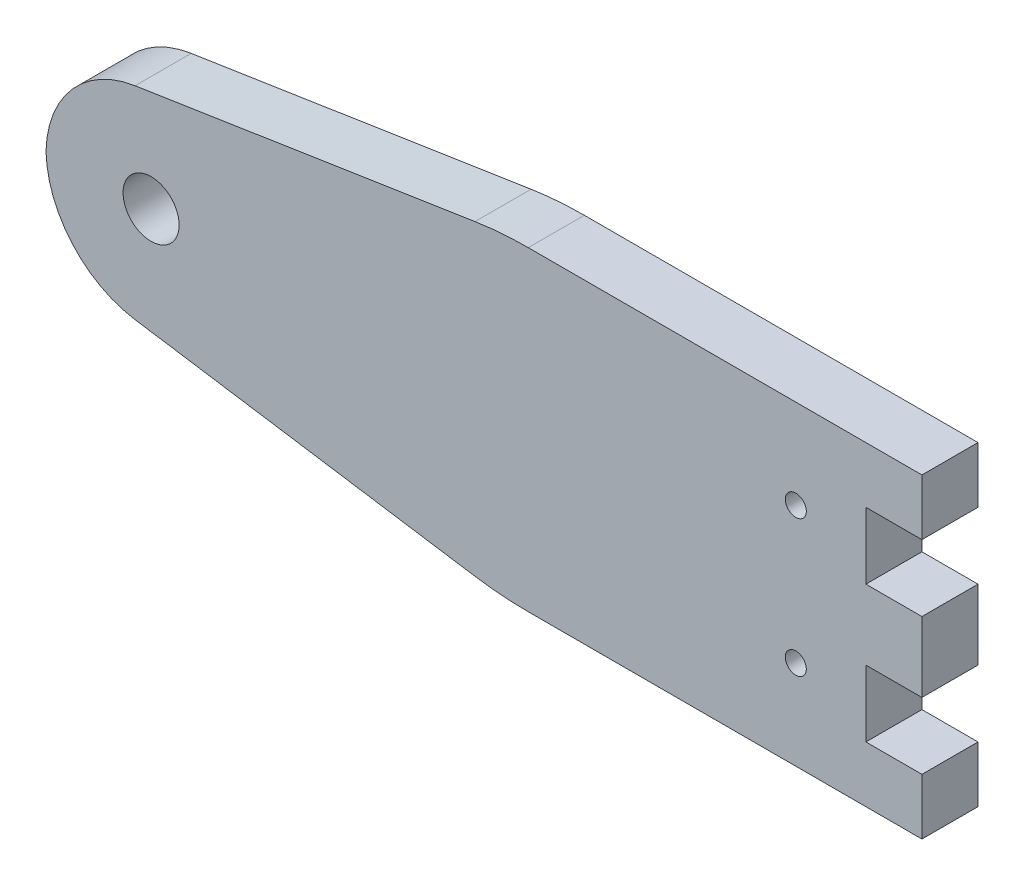
ISO-10303-21;
HEADER;
FILE_DESCRIPTION(('STEP AP214'),'2;1');
FILE_NAME('part.step','',(''),(''),'','','');
FILE_SCHEMA(('AUTOMOTIVE_DESIGN { 1 0 10303 214 1 1 1 1 }'));
ENDSEC;
DATA;
#1=APPLICATION_CONTEXT('core data for automotive mechanical design processes');
#2=APPLICATION_PROTOCOL_DEFINITION('international standard','automotive_design',2000,#1);
#3=PRODUCT_CONTEXT('',#1,'mechanical');
#4=PRODUCT('Part','Part','',(#3));
#5=PRODUCT_RELATED_PRODUCT_CATEGORY('part','',(#4));
#6=PRODUCT_DEFINITION_FORMATION('','',#4);
#7=PRODUCT_DEFINITION_CONTEXT('part definition',#1,'design');
#8=PRODUCT_DEFINITION('design','',#6,#7);
#9=PRODUCT_DEFINITION_SHAPE('','',#8);
#10=(LENGTH_UNIT() NAMED_UNIT(*) SI_UNIT(.MILLI.,.METRE.));
#11=(NAMED_UNIT(*) PLANE_ANGLE_UNIT() SI_UNIT($,.RADIAN.));
#12=(NAMED_UNIT(*) SI_UNIT($,.STERADIAN.) SOLID_ANGLE_UNIT());
#13=UNCERTAINTY_MEASURE_WITH_UNIT(LENGTH_MEASURE(1.E-05),#10,'distance_accuracy_value','');
#14=(GEOMETRIC_REPRESENTATION_CONTEXT(3) GLOBAL_UNCERTAINTY_ASSIGNED_CONTEXT((#13)) GLOBAL_UNIT_ASSIGNED_CONTEXT((#10,
#11,#12)) REPRESENTATION_CONTEXT('',''));
#15=CARTESIAN_POINT('',(0.,0.,0.));
#16=DIRECTION('',(0.,0.,1.));
#17=DIRECTION('',(1.,0.,0.));
#18=AXIS2_PLACEMENT_3D('',#15,#16,#17);
#19=CARTESIAN_POINT('',(0.,8.,8.));
#20=DIRECTION('',(0.,-1.,0.));
#21=DIRECTION('',(0.,0.,-1.));
#22=AXIS2_PLACEMENT_3D('',#19,#20,#21);
#23=PLANE('',#22);
#24=DIRECTION('',(-1.,0.,0.));
#25=VECTOR('',#24,1.);
#26=CARTESIAN_POINT('',(0.,8.,0.));
#27=LINE('',#26,#25);
#28=CARTESIAN_POINT('',(0.,8.,0.));
#29=VERTEX_POINT('',#28);
#30=CARTESIAN_POINT('',(-8.,8.,0.));
#31=VERTEX_POINT('',#30);
#32=EDGE_CURVE('E191',#29,#31,#27,.T.);
#33=ORIENTED_EDGE('',*,*,#32,.T.);
#34=DIRECTION('',(0.,0.,-1.));
#35=VECTOR('',#34,1.);
#36=CARTESIAN_POINT('',(-8.,8.,8.));
#37=LINE('',#36,#35);
#38=CARTESIAN_POINT('',(-8.,8.,8.));
#39=VERTEX_POINT('',#38);
#40=EDGE_CURVE('E168',#39,#31,#37,.T.);
#41=ORIENTED_EDGE('',*,*,#40,.F.);
#42=DIRECTION('',(-1.,0.,0.));
#43=VECTOR('',#42,1.);
#44=CARTESIAN_POINT('',(0.,8.,8.));
#45=LINE('',#44,#43);
#46=CARTESIAN_POINT('',(0.,8.,8.));
#47=VERTEX_POINT('',#46);
#48=EDGE_CURVE('E175',#47,#39,#45,.T.);
#49=ORIENTED_EDGE('',*,*,#48,.F.);
#50=DIRECTION('',(0.,0.,-1.));
#51=VECTOR('',#50,1.);
#52=CARTESIAN_POINT('',(0.,8.,8.));
#53=LINE('',#52,#51);
#54=EDGE_CURVE('E305',#47,#29,#53,.T.);
#55=ORIENTED_EDGE('',*,*,#54,.T.);
#56=EDGE_LOOP('',(#33,#41,#49,#55));
#57=FACE_BOUND('',#56,.T.);
#58=ADVANCED_FACE('F43',(#57),#23,.F.);
#59=CARTESIAN_POINT('',(-8.,0.,8.));
#60=DIRECTION('',(-1.,0.,0.));
#61=DIRECTION('',(0.,0.,1.));
#62=AXIS2_PLACEMENT_3D('',#59,#60,#61);
#63=PLANE('',#62);
#64=DIRECTION('',(0.,1.,0.));
#65=VECTOR('',#64,1.);
#66=CARTESIAN_POINT('',(-8.,0.,0.));
#67=LINE('',#66,#65);
#68=CARTESIAN_POINT('',(-8.,17.5,0.));
#69=VERTEX_POINT('',#68);
#70=EDGE_CURVE('E308',#31,#69,#67,.T.);
#71=ORIENTED_EDGE('',*,*,#70,.T.);
#72=DIRECTION('',(0.,0.,-1.));
#73=VECTOR('',#72,1.);
#74=CARTESIAN_POINT('',(-8.,17.5,8.));
#75=LINE('',#74,#73);
#76=CARTESIAN_POINT('',(-8.,17.5,8.));
#77=VERTEX_POINT('',#76);
#78=EDGE_CURVE('E171',#77,#69,#75,.T.);
#79=ORIENTED_EDGE('',*,*,#78,.F.);
#80=DIRECTION('',(0.,1.,0.));
#81=VECTOR('',#80,1.);
#82=CARTESIAN_POINT('',(-8.,0.,8.));
#83=LINE('',#82,#81);
#84=EDGE_CURVE('E164',#39,#77,#83,.T.);
#85=ORIENTED_EDGE('',*,*,#84,.F.);
#86=ORIENTED_EDGE('',*,*,#40,.T.);
#87=EDGE_LOOP('',(#71,#79,#85,#86));
#88=FACE_BOUND('',#87,.T.);
#89=ADVANCED_FACE('F166',(#88),#63,.F.);
#90=CARTESIAN_POINT('',(0.,17.5,8.));
#91=DIRECTION('',(0.,1.,0.));
#92=DIRECTION('',(0.,0.,1.));
#93=AXIS2_PLACEMENT_3D('',#90,#91,#92);
#94=PLANE('',#93);
#95=DIRECTION('',(1.,0.,0.));
#96=VECTOR('',#95,1.);
#97=CARTESIAN_POINT('',(0.,17.5,0.));
#98=LINE('',#97,#96);
#99=CARTESIAN_POINT('',(0.,17.5,0.));
#100=VERTEX_POINT('',#99);
#101=EDGE_CURVE('E311',#69,#100,#98,.T.);
#102=ORIENTED_EDGE('',*,*,#101,.T.);
#103=DIRECTION('',(0.,0.,-1.));
#104=VECTOR('',#103,1.);
#105=CARTESIAN_POINT('',(0.,17.5,8.));
#106=LINE('',#105,#104);
#107=CARTESIAN_POINT('',(0.,17.5,8.));
#108=VERTEX_POINT('',#107);
#109=EDGE_CURVE('E199',#108,#100,#106,.T.);
#110=ORIENTED_EDGE('',*,*,#109,.F.);
#111=DIRECTION('',(1.,0.,0.));
#112=VECTOR('',#111,1.);
#113=CARTESIAN_POINT('',(0.,17.5,8.));
#114=LINE('',#113,#112);
#115=EDGE_CURVE('E174',#77,#108,#114,.T.);
#116=ORIENTED_EDGE('',*,*,#115,.F.);
#117=ORIENTED_EDGE('',*,*,#78,.T.);
#118=EDGE_LOOP('',(#102,#110,#116,#117));
#119=FACE_BOUND('',#118,.T.);
#120=ADVANCED_FACE('F386',(#119),#94,.F.);
#121=CARTESIAN_POINT('',(0.,0.,8.));
#122=DIRECTION('',(-1.,0.,0.));
#123=DIRECTION('',(0.,0.,1.));
#124=AXIS2_PLACEMENT_3D('',#121,#122,#123);
#125=PLANE('',#124);
#126=DIRECTION('',(0.,1.,0.));
#127=VECTOR('',#126,1.);
#128=CARTESIAN_POINT('',(0.,0.,0.));
#129=LINE('',#128,#127);
#130=CARTESIAN_POINT('',(0.,27.5,0.));
#131=VERTEX_POINT('',#130);
#132=EDGE_CURVE('E315',#100,#131,#129,.T.);
#133=ORIENTED_EDGE('',*,*,#132,.T.);
#134=DIRECTION('',(0.,0.,-1.));
#135=VECTOR('',#134,1.);
#136=CARTESIAN_POINT('',(0.,27.5,8.));
#137=LINE('',#136,#135);
#138=CARTESIAN_POINT('',(0.,27.5,8.));
#139=VERTEX_POINT('',#138);
#140=EDGE_CURVE('E357',#139,#131,#137,.T.);
#141=ORIENTED_EDGE('',*,*,#140,.F.);
#142=DIRECTION('',(0.,1.,0.));
#143=VECTOR('',#142,1.);
#144=CARTESIAN_POINT('',(0.,0.,8.));
#145=LINE('',#144,#143);
#146=EDGE_CURVE('E283',#108,#139,#145,.T.);
#147=ORIENTED_EDGE('',*,*,#146,.F.);
#148=ORIENTED_EDGE('',*,*,#109,.T.);
#149=EDGE_LOOP('',(#133,#141,#147,#148));
#150=FACE_BOUND('',#149,.T.);
#151=ADVANCED_FACE('F366',(#150),#125,.F.);
#152=CARTESIAN_POINT('',(0.,27.5,8.));
#153=DIRECTION('',(0.,-1.,0.));
#154=DIRECTION('',(0.,0.,-1.));
#155=AXIS2_PLACEMENT_3D('',#152,#153,#154);
#156=PLANE('',#155);
#157=DIRECTION('',(-1.,0.,0.));
#158=VECTOR('',#157,1.);
#159=CARTESIAN_POINT('',(0.,27.5,0.));
#160=LINE('',#159,#158);
#161=CARTESIAN_POINT('',(-8.,27.5,0.));
#162=VERTEX_POINT('',#161);
#163=EDGE_CURVE('E318',#131,#162,#160,.T.);
#164=ORIENTED_EDGE('',*,*,#163,.T.);
#165=DIRECTION('',(0.,0.,-1.));
#166=VECTOR('',#165,1.);
#167=CARTESIAN_POINT('',(-8.,27.5,8.));
#168=LINE('',#167,#166);
#169=CARTESIAN_POINT('',(-8.,27.5,8.));
#170=VERTEX_POINT('',#169);
#171=EDGE_CURVE('E353',#170,#162,#168,.T.);
#172=ORIENTED_EDGE('',*,*,#171,.F.);
#173=DIRECTION('',(-1.,0.,0.));
#174=VECTOR('',#173,1.);
#175=CARTESIAN_POINT('',(0.,27.5,8.));
#176=LINE('',#175,#174);
#177=EDGE_CURVE('E286',#139,#170,#176,.T.);
#178=ORIENTED_EDGE('',*,*,#177,.F.);
#179=ORIENTED_EDGE('',*,*,#140,.T.);
#180=EDGE_LOOP('',(#164,#172,#178,#179));
#181=FACE_BOUND('',#180,.T.);
#182=ADVANCED_FACE('F377',(#181),#156,.F.);
#183=CARTESIAN_POINT('',(-8.,37.,0.));
#184=VERTEX_POINT('',#183);
#185=EDGE_CURVE('E312',#162,#184,#67,.T.);
#186=ORIENTED_EDGE('',*,*,#185,.T.);
#187=DIRECTION('',(0.,0.,-1.));
#188=VECTOR('',#187,1.);
#189=CARTESIAN_POINT('',(-8.,37.,8.));
#190=LINE('',#189,#188);
#191=CARTESIAN_POINT('',(-8.,37.,8.));
#192=VERTEX_POINT('',#191);
#193=EDGE_CURVE('E350',#192,#184,#190,.T.);
#194=ORIENTED_EDGE('',*,*,#193,.F.);
#195=EDGE_CURVE('E177',#170,#192,#83,.T.);
#196=ORIENTED_EDGE('',*,*,#195,.F.);
#197=ORIENTED_EDGE('',*,*,#171,.T.);
#198=EDGE_LOOP('',(#186,#194,#196,#197));
#199=FACE_BOUND('',#198,.T.);
#200=ADVANCED_FACE('F381',(#199),#63,.F.);
#201=CARTESIAN_POINT('',(0.,37.,8.));
#202=DIRECTION('',(0.,-1.,0.));
#203=DIRECTION('',(0.,0.,-1.));
#204=AXIS2_PLACEMENT_3D('',#201,#202,#203);
#205=PLANE('',#204);
#206=DIRECTION('',(-1.,0.,0.));
#207=VECTOR('',#206,1.);
#208=CARTESIAN_POINT('',(0.,37.,0.));
#209=LINE('',#208,#207);
#210=CARTESIAN_POINT('',(0.,37.,0.));
#211=VERTEX_POINT('',#210);
#212=EDGE_CURVE('E321',#211,#184,#209,.T.);
#213=ORIENTED_EDGE('',*,*,#212,.F.);
#214=DIRECTION('',(0.,0.,-1.));
#215=VECTOR('',#214,1.);
#216=CARTESIAN_POINT('',(0.,37.,8.));
#217=LINE('',#216,#215);
#218=CARTESIAN_POINT('',(0.,37.,8.));
#219=VERTEX_POINT('',#218);
#220=EDGE_CURVE('E347',#219,#211,#217,.T.);
#221=ORIENTED_EDGE('',*,*,#220,.F.);
#222=DIRECTION('',(-1.,0.,0.));
#223=VECTOR('',#222,1.);
#224=CARTESIAN_POINT('',(0.,37.,8.));
#225=LINE('',#224,#223);
#226=EDGE_CURVE('E289',#219,#192,#225,.T.);
#227=ORIENTED_EDGE('',*,*,#226,.T.);
#228=ORIENTED_EDGE('',*,*,#193,.T.);
#229=EDGE_LOOP('',(#213,#221,#227,#228));
#230=FACE_BOUND('',#229,.T.);
#231=ADVANCED_FACE('F459',(#230),#205,.T.);
#232=CARTESIAN_POINT('',(0.,0.,8.));
#233=DIRECTION('',(-1.,0.,0.));
#234=DIRECTION('',(0.,0.,1.));
#235=AXIS2_PLACEMENT_3D('',#232,#233,#234);
#236=PLANE('',#235);
#237=DIRECTION('',(0.,1.,0.));
#238=VECTOR('',#237,1.);
#239=CARTESIAN_POINT('',(0.,0.,0.));
#240=LINE('',#239,#238);
#241=CARTESIAN_POINT('',(0.,45.,0.));
#242=VERTEX_POINT('',#241);
#243=EDGE_CURVE('E325',#211,#242,#240,.T.);
#244=ORIENTED_EDGE('',*,*,#243,.T.);
#245=DIRECTION('',(0.,0.,-1.));
#246=VECTOR('',#245,1.);
#247=CARTESIAN_POINT('',(0.,45.,8.));
#248=LINE('',#247,#246);
#249=CARTESIAN_POINT('',(0.,45.,8.));
#250=VERTEX_POINT('',#249);
#251=EDGE_CURVE('E343',#250,#242,#248,.T.);
#252=ORIENTED_EDGE('',*,*,#251,.F.);
#253=DIRECTION('',(0.,1.,0.));
#254=VECTOR('',#253,1.);
#255=CARTESIAN_POINT('',(0.,0.,8.));
#256=LINE('',#255,#254);
#257=EDGE_CURVE('E293',#219,#250,#256,.T.);
#258=ORIENTED_EDGE('',*,*,#257,.F.);
#259=ORIENTED_EDGE('',*,*,#220,.T.);
#260=EDGE_LOOP('',(#244,#252,#258,#259));
#261=FACE_BOUND('',#260,.T.);
#262=ADVANCED_FACE('F455',(#261),#236,.F.);
#263=CARTESIAN_POINT('',(0.,45.,8.));
#264=DIRECTION('',(0.,-1.,0.));
#265=DIRECTION('',(1.,0.,0.));
#266=AXIS2_PLACEMENT_3D('',#263,#264,#265);
#267=PLANE('',#266);
#268=DIRECTION('',(-1.,0.,0.));
#269=VECTOR('',#268,1.);
#270=CARTESIAN_POINT('',(0.,45.,0.));
#271=LINE('',#270,#269);
#272=CARTESIAN_POINT('',(-56.1763390508509,45.,0.));
#273=VERTEX_POINT('',#272);
#274=EDGE_CURVE('E328',#242,#273,#271,.T.);
#275=ORIENTED_EDGE('',*,*,#274,.T.);
#276=DIRECTION('',(0.,0.,1.));
#277=VECTOR('',#276,1.);
#278=CARTESIAN_POINT('',(-56.1763390508509,45.,8.));
#279=LINE('',#278,#277);
#280=CARTESIAN_POINT('',(-56.1763390508509,45.,8.));
#281=VERTEX_POINT('',#280);
#282=EDGE_CURVE('E53',#273,#281,#279,.T.);
#283=ORIENTED_EDGE('',*,*,#282,.T.);
#284=DIRECTION('',(-1.,0.,0.));
#285=VECTOR('',#284,1.);
#286=CARTESIAN_POINT('',(0.,45.,8.));
#287=LINE('',#286,#285);
#288=EDGE_CURVE('E296',#250,#281,#287,.T.);
#289=ORIENTED_EDGE('',*,*,#288,.F.);
#290=ORIENTED_EDGE('',*,*,#251,.T.);
#291=EDGE_LOOP('',(#275,#283,#289,#290));
#292=FACE_BOUND('',#291,.T.);
#293=ADVANCED_FACE('F451',(#292),#267,.F.);
#294=CARTESIAN_POINT('',(0.,0.,8.));
#295=DIRECTION('',(0.,-1.,0.));
#296=DIRECTION('',(1.,0.,0.));
#297=AXIS2_PLACEMENT_3D('',#294,#295,#296);
#298=PLANE('',#297);
#299=DIRECTION('',(-1.,0.,0.));
#300=VECTOR('',#299,1.);
#301=CARTESIAN_POINT('',(0.,0.,8.));
#302=LINE('',#301,#300);
#303=CARTESIAN_POINT('',(0.,0.,8.));
#304=VERTEX_POINT('',#303);
#305=CARTESIAN_POINT('',(-56.176339050851,0.,8.));
#306=VERTEX_POINT('',#305);
#307=EDGE_CURVE('E299',#304,#306,#302,.T.);
#308=ORIENTED_EDGE('',*,*,#307,.T.);
#309=DIRECTION('',(0.,0.,1.));
#310=VECTOR('',#309,1.);
#311=CARTESIAN_POINT('',(-56.176339050851,0.,8.));
#312=LINE('',#311,#310);
#313=CARTESIAN_POINT('',(-56.176339050851,0.,0.));
#314=VERTEX_POINT('',#313);
#315=EDGE_CURVE('E232',#306,#314,#312,.F.);
#316=ORIENTED_EDGE('',*,*,#315,.T.);
#317=DIRECTION('',(-1.,0.,0.));
#318=VECTOR('',#317,1.);
#319=CARTESIAN_POINT('',(0.,0.,0.));
#320=LINE('',#319,#318);
#321=CARTESIAN_POINT('',(0.,0.,0.));
#322=VERTEX_POINT('',#321);
#323=EDGE_CURVE('E332',#322,#314,#320,.T.);
#324=ORIENTED_EDGE('',*,*,#323,.F.);
#325=DIRECTION('',(0.,0.,-1.));
#326=VECTOR('',#325,1.);
#327=CARTESIAN_POINT('',(0.,0.,8.));
#328=LINE('',#327,#326);
#329=EDGE_CURVE('E340',#304,#322,#328,.T.);
#330=ORIENTED_EDGE('',*,*,#329,.F.);
#331=EDGE_LOOP('',(#308,#316,#324,#330));
#332=FACE_BOUND('',#331,.T.);
#333=ADVANCED_FACE('F433',(#332),#298,.T.);
#334=CARTESIAN_POINT('',(0.,0.,8.));
#335=DIRECTION('',(-1.,0.,0.));
#336=DIRECTION('',(0.,0.,1.));
#337=AXIS2_PLACEMENT_3D('',#334,#335,#336);
#338=PLANE('',#337);
#339=DIRECTION('',(0.,1.,0.));
#340=VECTOR('',#339,1.);
#341=CARTESIAN_POINT('',(0.,0.,0.));
#342=LINE('',#341,#340);
#343=EDGE_CURVE('E188',#322,#29,#342,.T.);
#344=ORIENTED_EDGE('',*,*,#343,.T.);
#345=ORIENTED_EDGE('',*,*,#54,.F.);
#346=DIRECTION('',(0.,1.,0.));
#347=VECTOR('',#346,1.);
#348=CARTESIAN_POINT('',(0.,0.,8.));
#349=LINE('',#348,#347);
#350=EDGE_CURVE('E183',#304,#47,#349,.T.);
#351=ORIENTED_EDGE('',*,*,#350,.F.);
#352=ORIENTED_EDGE('',*,*,#329,.T.);
#353=EDGE_LOOP('',(#344,#345,#351,#352));
#354=FACE_BOUND('',#353,.T.);
#355=ADVANCED_FACE('F437',(#354),#338,.F.);
#356=CARTESIAN_POINT('',(0.,0.,8.));
#357=DIRECTION('',(0.,0.,1.));
#358=DIRECTION('',(1.,0.,0.));
#359=AXIS2_PLACEMENT_3D('',#356,#357,#358);
#360=PLANE('',#359);
#361=CARTESIAN_POINT('',(-18.,32.25,8.));
#362=DIRECTION('',(0.,0.,1.));
#363=DIRECTION('',(1.,0.,0.));
#364=AXIS2_PLACEMENT_3D('',#361,#362,#363);
#365=CIRCLE('',#364,1.5);
#366=CARTESIAN_POINT('',(-16.5,32.25,8.));
#367=VERTEX_POINT('',#366);
#368=EDGE_CURVE('E263',#367,#367,#365,.T.);
#369=ORIENTED_EDGE('',*,*,#368,.F.);
#370=EDGE_LOOP('',(#369));
#371=FACE_BOUND('',#370,.T.);
#372=CARTESIAN_POINT('',(-18.,12.75,8.));
#373=DIRECTION('',(0.,0.,1.));
#374=DIRECTION('',(1.,0.,0.));
#375=AXIS2_PLACEMENT_3D('',#372,#373,#374);
#376=CIRCLE('',#375,1.5);
#377=CARTESIAN_POINT('',(-16.5,12.75,8.));
#378=VERTEX_POINT('',#377);
#379=EDGE_CURVE('E270',#378,#378,#376,.T.);
#380=ORIENTED_EDGE('',*,*,#379,.F.);
#381=EDGE_LOOP('',(#380));
#382=FACE_BOUND('',#381,.T.);
#383=CARTESIAN_POINT('',(-110.,22.8687843514992,8.));
#384=DIRECTION('',(0.,0.,1.));
#385=DIRECTION('',(1.,0.,0.));
#386=AXIS2_PLACEMENT_3D('',#383,#384,#385);
#387=CIRCLE('',#386,4.00000000000001);
#388=CARTESIAN_POINT('',(-106.,22.8687843514992,8.));
#389=VERTEX_POINT('',#388);
#390=EDGE_CURVE('E259',#389,#389,#387,.T.);
#391=ORIENTED_EDGE('',*,*,#390,.F.);
#392=EDGE_LOOP('',(#391));
#393=FACE_BOUND('',#392,.T.);
#394=DIRECTION('',(-0.988371697650618,0.152057184253938,0.));
#395=VECTOR('',#394,1.);
#396=CARTESIAN_POINT('',(-1.38728323699412,-9.017341040462,8.));
#397=LINE('',#396,#395);
#398=CARTESIAN_POINT('',(-112.280857763809,8.0432088867399,8.));
#399=VERTEX_POINT('',#398);
#400=CARTESIAN_POINT('',(-63.7791982635479,0.581415117469121,8.));
#401=VERTEX_POINT('',#400);
#402=EDGE_CURVE('E197',#399,#401,#397,.F.);
#403=ORIENTED_EDGE('',*,*,#402,.T.);
#404=CARTESIAN_POINT('',(-56.176339050851,50.,8.));
#405=DIRECTION('',(0.,0.,1.));
#406=DIRECTION('',(1.,0.,0.));
#407=AXIS2_PLACEMENT_3D('',#404,#405,#406);
#408=CIRCLE('',#407,50.);
#409=EDGE_CURVE('E252',#401,#306,#408,.T.);
#410=ORIENTED_EDGE('',*,*,#409,.T.);
#411=ORIENTED_EDGE('',*,*,#307,.F.);
#412=ORIENTED_EDGE('',*,*,#350,.T.);
#413=ORIENTED_EDGE('',*,*,#48,.T.);
#414=ORIENTED_EDGE('',*,*,#84,.T.);
#415=ORIENTED_EDGE('',*,*,#115,.T.);
#416=ORIENTED_EDGE('',*,*,#146,.T.);
#417=ORIENTED_EDGE('',*,*,#177,.T.);
#418=ORIENTED_EDGE('',*,*,#195,.T.);
#419=ORIENTED_EDGE('',*,*,#226,.F.);
#420=ORIENTED_EDGE('',*,*,#257,.T.);
#421=ORIENTED_EDGE('',*,*,#288,.T.);
#422=CARTESIAN_POINT('',(-56.1763390508509,-5.00000000000004,8.));
#423=DIRECTION('',(0.,0.,1.));
#424=DIRECTION('',(1.,0.,0.));
#425=AXIS2_PLACEMENT_3D('',#422,#423,#424);
#426=CIRCLE('',#425,50.);
#427=CARTESIAN_POINT('',(-63.7791982635478,44.4185848825308,8.));
#428=VERTEX_POINT('',#427);
#429=EDGE_CURVE('E61',#281,#428,#426,.T.);
#430=ORIENTED_EDGE('',*,*,#429,.T.);
#431=DIRECTION('',(-0.988371697650618,-0.152057184253938,0.));
#432=VECTOR('',#431,1.);
#433=CARTESIAN_POINT('',(-8.15028901734079,52.9768786127163,8.));
#434=LINE('',#433,#432);
#435=CARTESIAN_POINT('',(-112.280857763809,36.95679111326,8.));
#436=VERTEX_POINT('',#435);
#437=EDGE_CURVE('E209',#428,#436,#434,.T.);
#438=ORIENTED_EDGE('',*,*,#437,.T.);
#439=CARTESIAN_POINT('',(-110.,22.1312156485008,8.));
#440=DIRECTION('',(0.,0.,1.));
#441=DIRECTION('',(1.,0.,0.));
#442=AXIS2_PLACEMENT_3D('',#439,#440,#441);
#443=CIRCLE('',#442,15.);
#444=CARTESIAN_POINT('',(-124.99546591814,22.5,8.));
#445=VERTEX_POINT('',#444);
#446=EDGE_CURVE('E212',#436,#445,#443,.T.);
#447=ORIENTED_EDGE('',*,*,#446,.T.);
#448=CARTESIAN_POINT('',(-110.,22.8687843514992,8.));
#449=DIRECTION('',(0.,0.,1.));
#450=DIRECTION('',(1.,0.,0.));
#451=AXIS2_PLACEMENT_3D('',#448,#449,#450);
#452=CIRCLE('',#451,15.);
#453=EDGE_CURVE('E215',#445,#399,#452,.T.);
#454=ORIENTED_EDGE('',*,*,#453,.T.);
#455=EDGE_LOOP('',(#403,#410,#411,#412,#413,#414,#415,#416,#417,#418,#419,#420,#421,#430,#438,
#447,#454));
#456=FACE_BOUND('',#455,.T.);
#457=ADVANCED_FACE('F180',(#371,#382,#393,#456),#360,.T.);
#458=CARTESIAN_POINT('',(0.,0.,0.));
#459=DIRECTION('',(0.,0.,1.));
#460=DIRECTION('',(1.,0.,0.));
#461=AXIS2_PLACEMENT_3D('',#458,#459,#460);
#462=PLANE('',#461);
#463=CARTESIAN_POINT('',(-18.,32.25,0.));
#464=DIRECTION('',(0.,0.,1.));
#465=DIRECTION('',(1.,0.,0.));
#466=AXIS2_PLACEMENT_3D('',#463,#464,#465);
#467=CIRCLE('',#466,1.5);
#468=CARTESIAN_POINT('',(-16.5,32.25,0.));
#469=VERTEX_POINT('',#468);
#470=EDGE_CURVE('E47',#469,#469,#467,.T.);
#471=ORIENTED_EDGE('',*,*,#470,.T.);
#472=EDGE_LOOP('',(#471));
#473=FACE_BOUND('',#472,.T.);
#474=CARTESIAN_POINT('',(-18.,12.75,0.));
#475=DIRECTION('',(0.,0.,1.));
#476=DIRECTION('',(1.,0.,0.));
#477=AXIS2_PLACEMENT_3D('',#474,#475,#476);
#478=CIRCLE('',#477,1.5);
#479=CARTESIAN_POINT('',(-16.5,12.75,0.));
#480=VERTEX_POINT('',#479);
#481=EDGE_CURVE('E260',#480,#480,#478,.T.);
#482=ORIENTED_EDGE('',*,*,#481,.T.);
#483=EDGE_LOOP('',(#482));
#484=FACE_BOUND('',#483,.T.);
#485=CARTESIAN_POINT('',(-110.,22.8687843514992,0.));
#486=DIRECTION('',(0.,0.,1.));
#487=DIRECTION('',(1.,0.,0.));
#488=AXIS2_PLACEMENT_3D('',#485,#486,#487);
#489=CIRCLE('',#488,4.00000000000001);
#490=CARTESIAN_POINT('',(-106.,22.8687843514992,0.));
#491=VERTEX_POINT('',#490);
#492=EDGE_CURVE('E237',#491,#491,#489,.T.);
#493=ORIENTED_EDGE('',*,*,#492,.T.);
#494=EDGE_LOOP('',(#493));
#495=FACE_BOUND('',#494,.T.);
#496=ORIENTED_EDGE('',*,*,#323,.T.);
#497=CARTESIAN_POINT('',(-56.176339050851,50.,0.));
#498=DIRECTION('',(0.,0.,1.));
#499=DIRECTION('',(1.,0.,0.));
#500=AXIS2_PLACEMENT_3D('',#497,#498,#499);
#501=CIRCLE('',#500,50.);
#502=CARTESIAN_POINT('',(-63.7791982635479,0.58141511746912,0.));
#503=VERTEX_POINT('',#502);
#504=EDGE_CURVE('E244',#314,#503,#501,.F.);
#505=ORIENTED_EDGE('',*,*,#504,.T.);
#506=DIRECTION('',(0.988371697650618,-0.152057184253938,0.));
#507=VECTOR('',#506,1.);
#508=CARTESIAN_POINT('',(-59.9999999999985,0.,0.));
#509=LINE('',#508,#507);
#510=CARTESIAN_POINT('',(-112.280857763809,8.0432088867399,0.));
#511=VERTEX_POINT('',#510);
#512=EDGE_CURVE('E193',#503,#511,#509,.F.);
#513=ORIENTED_EDGE('',*,*,#512,.T.);
#514=CARTESIAN_POINT('',(-110.,22.8687843514992,0.));
#515=DIRECTION('',(0.,0.,1.));
#516=DIRECTION('',(1.,0.,0.));
#517=AXIS2_PLACEMENT_3D('',#514,#515,#516);
#518=CIRCLE('',#517,15.);
#519=CARTESIAN_POINT('',(-124.99546591814,22.5,0.));
#520=VERTEX_POINT('',#519);
#521=EDGE_CURVE('E225',#511,#520,#518,.F.);
#522=ORIENTED_EDGE('',*,*,#521,.T.);
#523=CARTESIAN_POINT('',(-110.,22.1312156485008,0.));
#524=DIRECTION('',(0.,0.,1.));
#525=DIRECTION('',(1.,0.,0.));
#526=AXIS2_PLACEMENT_3D('',#523,#524,#525);
#527=CIRCLE('',#526,15.);
#528=CARTESIAN_POINT('',(-112.280857763809,36.9567911132601,0.));
#529=VERTEX_POINT('',#528);
#530=EDGE_CURVE('E222',#520,#529,#527,.F.);
#531=ORIENTED_EDGE('',*,*,#530,.T.);
#532=DIRECTION('',(0.988371697650618,0.152057184253938,0.));
#533=VECTOR('',#532,1.);
#534=CARTESIAN_POINT('',(-125.,35.,0.));
#535=LINE('',#534,#533);
#536=CARTESIAN_POINT('',(-63.7791982635478,44.4185848825309,0.));
#537=VERTEX_POINT('',#536);
#538=EDGE_CURVE('E205',#529,#537,#535,.T.);
#539=ORIENTED_EDGE('',*,*,#538,.T.);
#540=CARTESIAN_POINT('',(-56.1763390508509,-5.00000000000004,0.));
#541=DIRECTION('',(0.,0.,1.));
#542=DIRECTION('',(1.,0.,0.));
#543=AXIS2_PLACEMENT_3D('',#540,#541,#542);
#544=CIRCLE('',#543,50.);
#545=EDGE_CURVE('E241',#537,#273,#544,.F.);
#546=ORIENTED_EDGE('',*,*,#545,.T.);
#547=ORIENTED_EDGE('',*,*,#274,.F.);
#548=ORIENTED_EDGE('',*,*,#243,.F.);
#549=ORIENTED_EDGE('',*,*,#212,.T.);
#550=ORIENTED_EDGE('',*,*,#185,.F.);
#551=ORIENTED_EDGE('',*,*,#163,.F.);
#552=ORIENTED_EDGE('',*,*,#132,.F.);
#553=ORIENTED_EDGE('',*,*,#101,.F.);
#554=ORIENTED_EDGE('',*,*,#70,.F.);
#555=ORIENTED_EDGE('',*,*,#32,.F.);
#556=ORIENTED_EDGE('',*,*,#343,.F.);
#557=EDGE_LOOP('',(#496,#505,#513,#522,#531,#539,#546,#547,#548,#549,#550,#551,#552,#553,#554,
#555,#556));
#558=FACE_BOUND('',#557,.T.);
#559=ADVANCED_FACE('F372',(#473,#484,#495,#558),#462,.F.);
#560=CARTESIAN_POINT('',(-59.9999999999985,0.,8.));
#561=DIRECTION('',(0.152057184253938,0.988371697650617,0.));
#562=DIRECTION('',(0.,0.,-1.));
#563=AXIS2_PLACEMENT_3D('',#560,#561,#562);
#564=PLANE('',#563);
#565=ORIENTED_EDGE('',*,*,#512,.F.);
#566=DIRECTION('',(0.,0.,-1.));
#567=VECTOR('',#566,1.);
#568=CARTESIAN_POINT('',(-63.7791982635479,0.58141511746912,8.));
#569=LINE('',#568,#567);
#570=EDGE_CURVE('E247',#503,#401,#569,.F.);
#571=ORIENTED_EDGE('',*,*,#570,.T.);
#572=ORIENTED_EDGE('',*,*,#402,.F.);
#573=DIRECTION('',(0.,0.,1.));
#574=VECTOR('',#573,1.);
#575=CARTESIAN_POINT('',(-112.280857763809,8.0432088867399,8.));
#576=LINE('',#575,#574);
#577=EDGE_CURVE('E218',#399,#511,#576,.F.);
#578=ORIENTED_EDGE('',*,*,#577,.T.);
#579=EDGE_LOOP('',(#565,#571,#572,#578));
#580=FACE_BOUND('',#579,.T.);
#581=ADVANCED_FACE('F401',(#580),#564,.F.);
#582=CARTESIAN_POINT('',(-125.,35.,8.));
#583=DIRECTION('',(-0.152057184253938,0.988371697650618,0.));
#584=DIRECTION('',(0.,0.,1.));
#585=AXIS2_PLACEMENT_3D('',#582,#583,#584);
#586=PLANE('',#585);
#587=ORIENTED_EDGE('',*,*,#437,.F.);
#588=DIRECTION('',(0.,0.,1.));
#589=VECTOR('',#588,1.);
#590=CARTESIAN_POINT('',(-63.7791982635478,44.4185848825308,0.));
#591=LINE('',#590,#589);
#592=EDGE_CURVE('E11',#428,#537,#591,.F.);
#593=ORIENTED_EDGE('',*,*,#592,.T.);
#594=ORIENTED_EDGE('',*,*,#538,.F.);
#595=DIRECTION('',(0.,0.,-1.));
#596=VECTOR('',#595,1.);
#597=CARTESIAN_POINT('',(-112.280857763809,36.9567911132601,8.));
#598=LINE('',#597,#596);
#599=EDGE_CURVE('E228',#529,#436,#598,.F.);
#600=ORIENTED_EDGE('',*,*,#599,.T.);
#601=EDGE_LOOP('',(#587,#593,#594,#600));
#602=FACE_BOUND('',#601,.T.);
#603=ADVANCED_FACE('F407',(#602),#586,.T.);
#604=CARTESIAN_POINT('',(-110.,22.1312156485008,8.));
#605=DIRECTION('',(0.,0.,-1.));
#606=DIRECTION('',(-1.,0.,0.));
#607=AXIS2_PLACEMENT_3D('',#604,#605,#606);
#608=CYLINDRICAL_SURFACE('',#607,15.);
#609=ORIENTED_EDGE('',*,*,#599,.F.);
#610=ORIENTED_EDGE('',*,*,#530,.F.);
#611=DIRECTION('',(0.,0.,-1.));
#612=VECTOR('',#611,1.);
#613=CARTESIAN_POINT('',(-124.99546591814,22.5,4.));
#614=LINE('',#613,#612);
#615=EDGE_CURVE('E233',#445,#520,#614,.T.);
#616=ORIENTED_EDGE('',*,*,#615,.F.);
#617=ORIENTED_EDGE('',*,*,#446,.F.);
#618=EDGE_LOOP('',(#609,#610,#616,#617));
#619=FACE_BOUND('',#618,.T.);
#620=ADVANCED_FACE('F413',(#619),#608,.T.);
#621=CARTESIAN_POINT('',(-110.,22.8687843514992,8.));
#622=DIRECTION('',(0.,0.,-1.));
#623=DIRECTION('',(-1.,0.,0.));
#624=AXIS2_PLACEMENT_3D('',#621,#622,#623);
#625=CYLINDRICAL_SURFACE('',#624,15.);
#626=ORIENTED_EDGE('',*,*,#521,.F.);
#627=ORIENTED_EDGE('',*,*,#577,.F.);
#628=ORIENTED_EDGE('',*,*,#453,.F.);
#629=ORIENTED_EDGE('',*,*,#615,.T.);
#630=EDGE_LOOP('',(#626,#627,#628,#629));
#631=FACE_BOUND('',#630,.T.);
#632=ADVANCED_FACE('F415',(#631),#625,.T.);
#633=CARTESIAN_POINT('',(-56.176339050851,50.,8.));
#634=DIRECTION('',(0.,0.,1.));
#635=DIRECTION('',(1.,0.,0.));
#636=AXIS2_PLACEMENT_3D('',#633,#634,#635);
#637=CYLINDRICAL_SURFACE('',#636,50.);
#638=ORIENTED_EDGE('',*,*,#409,.F.);
#639=ORIENTED_EDGE('',*,*,#570,.F.);
#640=ORIENTED_EDGE('',*,*,#504,.F.);
#641=ORIENTED_EDGE('',*,*,#315,.F.);
#642=EDGE_LOOP('',(#638,#639,#640,#641));
#643=FACE_BOUND('',#642,.T.);
#644=ADVANCED_FACE('F418',(#643),#637,.T.);
#645=CARTESIAN_POINT('',(-56.1763390508509,-5.00000000000004,8.));
#646=DIRECTION('',(0.,0.,-1.));
#647=DIRECTION('',(-1.,0.,0.));
#648=AXIS2_PLACEMENT_3D('',#645,#646,#647);
#649=CYLINDRICAL_SURFACE('',#648,50.);
#650=ORIENTED_EDGE('',*,*,#545,.F.);
#651=ORIENTED_EDGE('',*,*,#592,.F.);
#652=ORIENTED_EDGE('',*,*,#429,.F.);
#653=ORIENTED_EDGE('',*,*,#282,.F.);
#654=EDGE_LOOP('',(#650,#651,#652,#653));
#655=FACE_BOUND('',#654,.T.);
#656=ADVANCED_FACE('F45',(#655),#649,.T.);
#657=CARTESIAN_POINT('',(-110.,22.8687843514992,-72.));
#658=DIRECTION('',(0.,0.,1.));
#659=DIRECTION('',(1.,0.,0.));
#660=AXIS2_PLACEMENT_3D('',#657,#658,#659);
#661=CYLINDRICAL_SURFACE('',#660,4.00000000000001);
#662=ORIENTED_EDGE('',*,*,#390,.T.);
#663=EDGE_LOOP('',(#662));
#664=FACE_BOUND('',#663,.T.);
#665=ORIENTED_EDGE('',*,*,#492,.F.);
#666=EDGE_LOOP('',(#665));
#667=FACE_BOUND('',#666,.T.);
#668=ADVANCED_FACE('F427',(#664,#667),#661,.F.);
#669=CARTESIAN_POINT('',(-18.,12.75,-7.));
#670=DIRECTION('',(0.,0.,1.));
#671=DIRECTION('',(1.,0.,0.));
#672=AXIS2_PLACEMENT_3D('',#669,#670,#671);
#673=CYLINDRICAL_SURFACE('',#672,1.5);
#674=ORIENTED_EDGE('',*,*,#379,.T.);
#675=EDGE_LOOP('',(#674));
#676=FACE_BOUND('',#675,.T.);
#677=ORIENTED_EDGE('',*,*,#481,.F.);
#678=EDGE_LOOP('',(#677));
#679=FACE_BOUND('',#678,.T.);
#680=ADVANCED_FACE('F563',(#676,#679),#673,.F.);
#681=CARTESIAN_POINT('',(-18.,32.25,-7.));
#682=DIRECTION('',(0.,0.,1.));
#683=DIRECTION('',(1.,0.,0.));
#684=AXIS2_PLACEMENT_3D('',#681,#682,#683);
#685=CYLINDRICAL_SURFACE('',#684,1.5);
#686=ORIENTED_EDGE('',*,*,#368,.T.);
#687=EDGE_LOOP('',(#686));
#688=FACE_BOUND('',#687,.T.);
#689=ORIENTED_EDGE('',*,*,#470,.F.);
#690=EDGE_LOOP('',(#689));
#691=FACE_BOUND('',#690,.T.);
#692=ADVANCED_FACE('F591',(#688,#691),#685,.F.);
#693=CLOSED_SHELL('',(#58,#89,#120,#151,#182,#200,#231,#262,#293,#333,#355,#457,#559,#581,#603,
#620,#632,#644,#656,#668,#680,#692));
#694=MANIFOLD_SOLID_BREP('B2',#693);
#695=ADVANCED_BREP_SHAPE_REPRESENTATION('',(#18,#694),#14);
#696=SHAPE_DEFINITION_REPRESENTATION(#9,#695);
ENDSEC;
END-ISO-10303-21;
